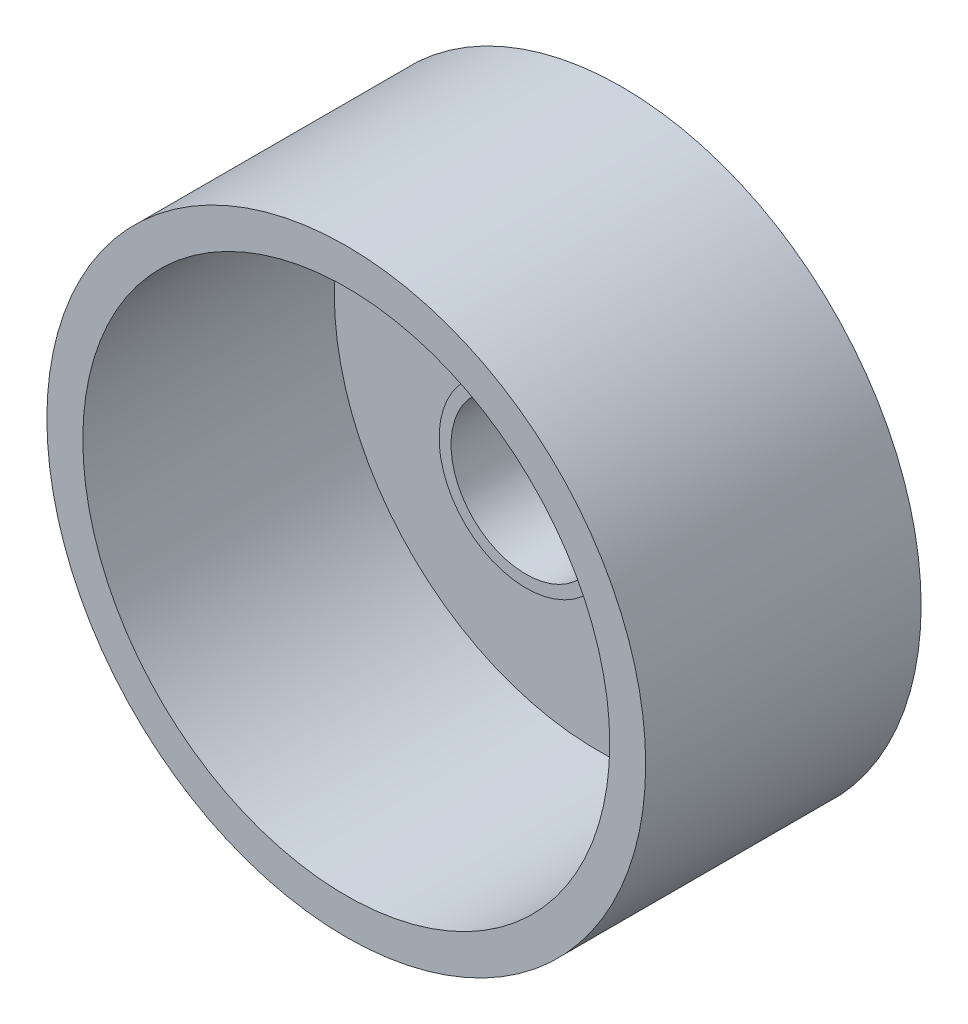
ISO-10303-21;
HEADER;
FILE_DESCRIPTION(('STEP AP214'),'2;1');
FILE_NAME('part.step','',(''),(''),'','','');
FILE_SCHEMA(('AUTOMOTIVE_DESIGN { 1 0 10303 214 1 1 1 1 }'));
ENDSEC;
DATA;
#1=APPLICATION_CONTEXT('core data for automotive mechanical design processes');
#2=APPLICATION_PROTOCOL_DEFINITION('international standard','automotive_design',2000,#1);
#3=PRODUCT_CONTEXT('',#1,'mechanical');
#4=PRODUCT('Part','Part','',(#3));
#5=PRODUCT_RELATED_PRODUCT_CATEGORY('part','',(#4));
#6=PRODUCT_DEFINITION_FORMATION('','',#4);
#7=PRODUCT_DEFINITION_CONTEXT('part definition',#1,'design');
#8=PRODUCT_DEFINITION('design','',#6,#7);
#9=PRODUCT_DEFINITION_SHAPE('','',#8);
#10=(LENGTH_UNIT() NAMED_UNIT(*) SI_UNIT(.MILLI.,.METRE.));
#11=(NAMED_UNIT(*) PLANE_ANGLE_UNIT() SI_UNIT($,.RADIAN.));
#12=(NAMED_UNIT(*) SI_UNIT($,.STERADIAN.) SOLID_ANGLE_UNIT());
#13=UNCERTAINTY_MEASURE_WITH_UNIT(LENGTH_MEASURE(1.E-05),#10,'distance_accuracy_value','');
#14=(GEOMETRIC_REPRESENTATION_CONTEXT(3) GLOBAL_UNCERTAINTY_ASSIGNED_CONTEXT((#13)) GLOBAL_UNIT_ASSIGNED_CONTEXT((#10,
#11,#12)) REPRESENTATION_CONTEXT('',''));
#15=CARTESIAN_POINT('',(0.,0.,0.));
#16=DIRECTION('',(0.,0.,1.));
#17=DIRECTION('',(1.,0.,0.));
#18=AXIS2_PLACEMENT_3D('',#15,#16,#17);
#19=CARTESIAN_POINT('',(0.,0.,1.));
#20=DIRECTION('',(0.,0.,-1.));
#21=DIRECTION('',(-1.,0.,0.));
#22=AXIS2_PLACEMENT_3D('',#19,#20,#21);
#23=CYLINDRICAL_SURFACE('',#22,12.5);
#24=CARTESIAN_POINT('',(0.,0.,0.));
#25=DIRECTION('',(0.,0.,1.));
#26=DIRECTION('',(1.,0.,0.));
#27=AXIS2_PLACEMENT_3D('',#24,#25,#26);
#28=CIRCLE('',#27,12.5);
#29=CARTESIAN_POINT('',(12.5,0.,0.));
#30=VERTEX_POINT('',#29);
#31=EDGE_CURVE('E50',#30,#30,#28,.T.);
#32=ORIENTED_EDGE('',*,*,#31,.T.);
#33=EDGE_LOOP('',(#32));
#34=FACE_BOUND('',#33,.T.);
#35=CARTESIAN_POINT('',(0.,0.,11.5));
#36=DIRECTION('',(0.,0.,1.));
#37=DIRECTION('',(1.,0.,0.));
#38=AXIS2_PLACEMENT_3D('',#35,#36,#37);
#39=CIRCLE('',#38,12.5);
#40=CARTESIAN_POINT('',(12.5,0.,11.5));
#41=VERTEX_POINT('',#40);
#42=EDGE_CURVE('E53',#41,#41,#39,.T.);
#43=ORIENTED_EDGE('',*,*,#42,.F.);
#44=EDGE_LOOP('',(#43));
#45=FACE_BOUND('',#44,.T.);
#46=ADVANCED_FACE('F39',(#34,#45),#23,.T.);
#47=CARTESIAN_POINT('',(0.,0.,1.));
#48=DIRECTION('',(0.,0.,-1.));
#49=DIRECTION('',(-1.,0.,0.));
#50=AXIS2_PLACEMENT_3D('',#47,#48,#49);
#51=CYLINDRICAL_SURFACE('',#50,3.125);
#52=CARTESIAN_POINT('',(0.,0.,0.));
#53=DIRECTION('',(0.,0.,1.));
#54=DIRECTION('',(1.,0.,0.));
#55=AXIS2_PLACEMENT_3D('',#52,#53,#54);
#56=CIRCLE('',#55,3.125);
#57=CARTESIAN_POINT('',(3.125,0.,0.));
#58=VERTEX_POINT('',#57);
#59=EDGE_CURVE('E42',#58,#58,#56,.T.);
#60=ORIENTED_EDGE('',*,*,#59,.F.);
#61=EDGE_LOOP('',(#60));
#62=FACE_BOUND('',#61,.T.);
#63=CARTESIAN_POINT('',(0.,0.,4.));
#64=DIRECTION('',(0.,0.,1.));
#65=DIRECTION('',(1.,0.,0.));
#66=AXIS2_PLACEMENT_3D('',#63,#64,#65);
#67=CIRCLE('',#66,3.125);
#68=CARTESIAN_POINT('',(3.125,0.,4.));
#69=VERTEX_POINT('',#68);
#70=EDGE_CURVE('E55',#69,#69,#67,.T.);
#71=ORIENTED_EDGE('',*,*,#70,.T.);
#72=EDGE_LOOP('',(#71));
#73=FACE_BOUND('',#72,.T.);
#74=ADVANCED_FACE('F82',(#62,#73),#51,.F.);
#75=CARTESIAN_POINT('',(0.,0.,1.));
#76=DIRECTION('',(0.,0.,1.));
#77=DIRECTION('',(1.,0.,0.));
#78=AXIS2_PLACEMENT_3D('',#75,#76,#77);
#79=PLANE('',#78);
#80=CARTESIAN_POINT('',(0.,0.,1.));
#81=DIRECTION('',(0.,0.,1.));
#82=DIRECTION('',(1.,0.,0.));
#83=AXIS2_PLACEMENT_3D('',#80,#81,#82);
#84=CIRCLE('',#83,11.);
#85=CARTESIAN_POINT('',(11.,0.,1.));
#86=VERTEX_POINT('',#85);
#87=EDGE_CURVE('E10',#86,#86,#84,.F.);
#88=ORIENTED_EDGE('',*,*,#87,.F.);
#89=EDGE_LOOP('',(#88));
#90=FACE_BOUND('',#89,.T.);
#91=CARTESIAN_POINT('',(0.,0.,1.));
#92=DIRECTION('',(0.,0.,1.));
#93=DIRECTION('',(1.,0.,0.));
#94=AXIS2_PLACEMENT_3D('',#91,#92,#93);
#95=CIRCLE('',#94,3.625);
#96=CARTESIAN_POINT('',(3.625,0.,1.));
#97=VERTEX_POINT('',#96);
#98=EDGE_CURVE('E61',#97,#97,#95,.F.);
#99=ORIENTED_EDGE('',*,*,#98,.T.);
#100=EDGE_LOOP('',(#99));
#101=FACE_BOUND('',#100,.T.);
#102=ADVANCED_FACE('F71',(#90,#101),#79,.T.);
#103=CARTESIAN_POINT('',(0.,0.,0.));
#104=DIRECTION('',(0.,0.,1.));
#105=DIRECTION('',(1.,0.,0.));
#106=AXIS2_PLACEMENT_3D('',#103,#104,#105);
#107=PLANE('',#106);
#108=ORIENTED_EDGE('',*,*,#59,.T.);
#109=EDGE_LOOP('',(#108));
#110=FACE_BOUND('',#109,.T.);
#111=ORIENTED_EDGE('',*,*,#31,.F.);
#112=EDGE_LOOP('',(#111));
#113=FACE_BOUND('',#112,.T.);
#114=ADVANCED_FACE('F68',(#110,#113),#107,.F.);
#115=CARTESIAN_POINT('',(0.,0.,4.));
#116=DIRECTION('',(0.,0.,-1.));
#117=DIRECTION('',(-1.,0.,0.));
#118=AXIS2_PLACEMENT_3D('',#115,#116,#117);
#119=CYLINDRICAL_SURFACE('',#118,3.625);
#120=ORIENTED_EDGE('',*,*,#98,.F.);
#121=EDGE_LOOP('',(#120));
#122=FACE_BOUND('',#121,.T.);
#123=CARTESIAN_POINT('',(0.,0.,4.));
#124=DIRECTION('',(0.,0.,1.));
#125=DIRECTION('',(1.,0.,0.));
#126=AXIS2_PLACEMENT_3D('',#123,#124,#125);
#127=CIRCLE('',#126,3.625);
#128=CARTESIAN_POINT('',(3.625,0.,4.));
#129=VERTEX_POINT('',#128);
#130=EDGE_CURVE('E58',#129,#129,#127,.T.);
#131=ORIENTED_EDGE('',*,*,#130,.F.);
#132=EDGE_LOOP('',(#131));
#133=FACE_BOUND('',#132,.T.);
#134=ADVANCED_FACE('F70',(#122,#133),#119,.T.);
#135=CARTESIAN_POINT('',(0.,0.,4.));
#136=DIRECTION('',(0.,0.,1.));
#137=DIRECTION('',(1.,0.,0.));
#138=AXIS2_PLACEMENT_3D('',#135,#136,#137);
#139=PLANE('',#138);
#140=ORIENTED_EDGE('',*,*,#70,.F.);
#141=EDGE_LOOP('',(#140));
#142=FACE_BOUND('',#141,.T.);
#143=ORIENTED_EDGE('',*,*,#130,.T.);
#144=EDGE_LOOP('',(#143));
#145=FACE_BOUND('',#144,.T.);
#146=ADVANCED_FACE('F79',(#142,#145),#139,.T.);
#147=CARTESIAN_POINT('',(0.,0.,11.5));
#148=DIRECTION('',(0.,0.,-1.));
#149=DIRECTION('',(-1.,0.,0.));
#150=AXIS2_PLACEMENT_3D('',#147,#148,#149);
#151=CYLINDRICAL_SURFACE('',#150,11.);
#152=ORIENTED_EDGE('',*,*,#87,.T.);
#153=EDGE_LOOP('',(#152));
#154=FACE_BOUND('',#153,.T.);
#155=CARTESIAN_POINT('',(0.,0.,11.5));
#156=DIRECTION('',(0.,0.,1.));
#157=DIRECTION('',(1.,0.,0.));
#158=AXIS2_PLACEMENT_3D('',#155,#156,#157);
#159=CIRCLE('',#158,11.);
#160=CARTESIAN_POINT('',(11.,0.,11.5));
#161=VERTEX_POINT('',#160);
#162=EDGE_CURVE('E114',#161,#161,#159,.T.);
#163=ORIENTED_EDGE('',*,*,#162,.T.);
#164=EDGE_LOOP('',(#163));
#165=FACE_BOUND('',#164,.T.);
#166=ADVANCED_FACE('F98',(#154,#165),#151,.F.);
#167=CARTESIAN_POINT('',(0.,0.,11.5));
#168=DIRECTION('',(0.,0.,1.));
#169=DIRECTION('',(1.,0.,0.));
#170=AXIS2_PLACEMENT_3D('',#167,#168,#169);
#171=PLANE('',#170);
#172=ORIENTED_EDGE('',*,*,#162,.F.);
#173=EDGE_LOOP('',(#172));
#174=FACE_BOUND('',#173,.T.);
#175=ORIENTED_EDGE('',*,*,#42,.T.);
#176=EDGE_LOOP('',(#175));
#177=FACE_BOUND('',#176,.T.);
#178=ADVANCED_FACE('F104',(#174,#177),#171,.T.);
#179=CLOSED_SHELL('',(#46,#74,#102,#114,#134,#146,#166,#178));
#180=MANIFOLD_SOLID_BREP('B2',#179);
#181=ADVANCED_BREP_SHAPE_REPRESENTATION('',(#18,#180),#14);
#182=SHAPE_DEFINITION_REPRESENTATION(#9,#181);
ENDSEC;
END-ISO-10303-21;
